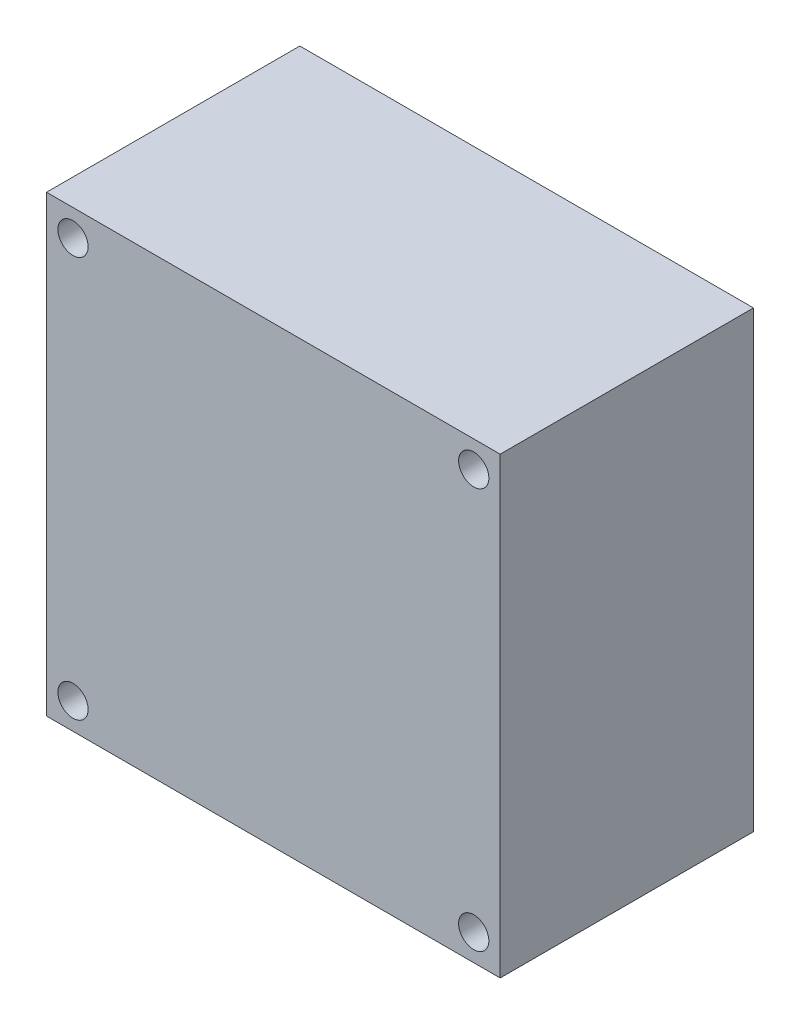
ISO-10303-21;
HEADER;
FILE_DESCRIPTION(('STEP AP214'),'2;1');
FILE_NAME('part.step','',(''),(''),'','','');
FILE_SCHEMA(('AUTOMOTIVE_DESIGN { 1 0 10303 214 1 1 1 1 }'));
ENDSEC;
DATA;
#1=APPLICATION_CONTEXT('core data for automotive mechanical design processes');
#2=APPLICATION_PROTOCOL_DEFINITION('international standard','automotive_design',2000,#1);
#3=PRODUCT_CONTEXT('',#1,'mechanical');
#4=PRODUCT('Part','Part','',(#3));
#5=PRODUCT_RELATED_PRODUCT_CATEGORY('part','',(#4));
#6=PRODUCT_DEFINITION_FORMATION('','',#4);
#7=PRODUCT_DEFINITION_CONTEXT('part definition',#1,'design');
#8=PRODUCT_DEFINITION('design','',#6,#7);
#9=PRODUCT_DEFINITION_SHAPE('','',#8);
#10=(LENGTH_UNIT() NAMED_UNIT(*) SI_UNIT(.MILLI.,.METRE.));
#11=(NAMED_UNIT(*) PLANE_ANGLE_UNIT() SI_UNIT($,.RADIAN.));
#12=(NAMED_UNIT(*) SI_UNIT($,.STERADIAN.) SOLID_ANGLE_UNIT());
#13=UNCERTAINTY_MEASURE_WITH_UNIT(LENGTH_MEASURE(1.E-05),#10,'distance_accuracy_value','');
#14=(GEOMETRIC_REPRESENTATION_CONTEXT(3) GLOBAL_UNCERTAINTY_ASSIGNED_CONTEXT((#13)) GLOBAL_UNIT_ASSIGNED_CONTEXT((#10,
#11,#12)) REPRESENTATION_CONTEXT('',''));
#15=CARTESIAN_POINT('',(0.,0.,0.));
#16=DIRECTION('',(0.,0.,1.));
#17=DIRECTION('',(1.,0.,0.));
#18=AXIS2_PLACEMENT_3D('',#15,#16,#17);
#19=CARTESIAN_POINT('',(0.,0.,67.));
#20=DIRECTION('',(1.,0.,0.));
#21=DIRECTION('',(0.,1.,0.));
#22=AXIS2_PLACEMENT_3D('',#19,#20,#21);
#23=PLANE('',#22);
#24=DIRECTION('',(0.,-1.,0.));
#25=VECTOR('',#24,1.);
#26=CARTESIAN_POINT('',(0.,0.,0.));
#27=LINE('',#26,#25);
#28=CARTESIAN_POINT('',(0.,120.,0.));
#29=VERTEX_POINT('',#28);
#30=CARTESIAN_POINT('',(0.,0.,0.));
#31=VERTEX_POINT('',#30);
#32=EDGE_CURVE('E111',#29,#31,#27,.T.);
#33=ORIENTED_EDGE('',*,*,#32,.T.);
#34=DIRECTION('',(0.,0.,-1.));
#35=VECTOR('',#34,1.);
#36=CARTESIAN_POINT('',(0.,0.,67.));
#37=LINE('',#36,#35);
#38=CARTESIAN_POINT('',(0.,0.,67.));
#39=VERTEX_POINT('',#38);
#40=EDGE_CURVE('E11',#39,#31,#37,.T.);
#41=ORIENTED_EDGE('',*,*,#40,.F.);
#42=DIRECTION('',(0.,-1.,0.));
#43=VECTOR('',#42,1.);
#44=CARTESIAN_POINT('',(0.,0.,67.));
#45=LINE('',#44,#43);
#46=CARTESIAN_POINT('',(0.,120.,67.));
#47=VERTEX_POINT('',#46);
#48=EDGE_CURVE('E95',#47,#39,#45,.T.);
#49=ORIENTED_EDGE('',*,*,#48,.F.);
#50=DIRECTION('',(0.,0.,-1.));
#51=VECTOR('',#50,1.);
#52=CARTESIAN_POINT('',(0.,120.,67.));
#53=LINE('',#52,#51);
#54=EDGE_CURVE('E107',#47,#29,#53,.T.);
#55=ORIENTED_EDGE('',*,*,#54,.T.);
#56=EDGE_LOOP('',(#33,#41,#49,#55));
#57=FACE_BOUND('',#56,.T.);
#58=ADVANCED_FACE('F43',(#57),#23,.F.);
#59=CARTESIAN_POINT('',(0.,0.,67.));
#60=DIRECTION('',(0.,1.,0.));
#61=DIRECTION('',(0.,0.,1.));
#62=AXIS2_PLACEMENT_3D('',#59,#60,#61);
#63=PLANE('',#62);
#64=DIRECTION('',(1.,0.,0.));
#65=VECTOR('',#64,1.);
#66=CARTESIAN_POINT('',(0.,0.,0.));
#67=LINE('',#66,#65);
#68=CARTESIAN_POINT('',(120.,0.,0.));
#69=VERTEX_POINT('',#68);
#70=EDGE_CURVE('E100',#31,#69,#67,.T.);
#71=ORIENTED_EDGE('',*,*,#70,.T.);
#72=DIRECTION('',(0.,0.,-1.));
#73=VECTOR('',#72,1.);
#74=CARTESIAN_POINT('',(120.,0.,67.));
#75=LINE('',#74,#73);
#76=CARTESIAN_POINT('',(120.,0.,67.));
#77=VERTEX_POINT('',#76);
#78=EDGE_CURVE('E52',#77,#69,#75,.T.);
#79=ORIENTED_EDGE('',*,*,#78,.F.);
#80=DIRECTION('',(1.,0.,0.));
#81=VECTOR('',#80,1.);
#82=CARTESIAN_POINT('',(0.,0.,67.));
#83=LINE('',#82,#81);
#84=EDGE_CURVE('E90',#39,#77,#83,.T.);
#85=ORIENTED_EDGE('',*,*,#84,.F.);
#86=ORIENTED_EDGE('',*,*,#40,.T.);
#87=EDGE_LOOP('',(#71,#79,#85,#86));
#88=FACE_BOUND('',#87,.T.);
#89=ADVANCED_FACE('F99',(#88),#63,.F.);
#90=CARTESIAN_POINT('',(120.,0.,67.));
#91=DIRECTION('',(-1.,0.,0.));
#92=DIRECTION('',(0.,-1.,0.));
#93=AXIS2_PLACEMENT_3D('',#90,#91,#92);
#94=PLANE('',#93);
#95=DIRECTION('',(0.,1.,0.));
#96=VECTOR('',#95,1.);
#97=CARTESIAN_POINT('',(120.,0.,0.));
#98=LINE('',#97,#96);
#99=CARTESIAN_POINT('',(120.,120.,0.));
#100=VERTEX_POINT('',#99);
#101=EDGE_CURVE('E77',#69,#100,#98,.T.);
#102=ORIENTED_EDGE('',*,*,#101,.T.);
#103=DIRECTION('',(0.,0.,-1.));
#104=VECTOR('',#103,1.);
#105=CARTESIAN_POINT('',(120.,120.,67.));
#106=LINE('',#105,#104);
#107=CARTESIAN_POINT('',(120.,120.,67.));
#108=VERTEX_POINT('',#107);
#109=EDGE_CURVE('E102',#108,#100,#106,.T.);
#110=ORIENTED_EDGE('',*,*,#109,.F.);
#111=DIRECTION('',(0.,1.,0.));
#112=VECTOR('',#111,1.);
#113=CARTESIAN_POINT('',(120.,0.,67.));
#114=LINE('',#113,#112);
#115=EDGE_CURVE('E93',#77,#108,#114,.T.);
#116=ORIENTED_EDGE('',*,*,#115,.F.);
#117=ORIENTED_EDGE('',*,*,#78,.T.);
#118=EDGE_LOOP('',(#102,#110,#116,#117));
#119=FACE_BOUND('',#118,.T.);
#120=ADVANCED_FACE('F103',(#119),#94,.F.);
#121=CARTESIAN_POINT('',(0.,120.,67.));
#122=DIRECTION('',(0.,-1.,0.));
#123=DIRECTION('',(0.,0.,-1.));
#124=AXIS2_PLACEMENT_3D('',#121,#122,#123);
#125=PLANE('',#124);
#126=DIRECTION('',(-1.,0.,0.));
#127=VECTOR('',#126,1.);
#128=CARTESIAN_POINT('',(0.,120.,0.));
#129=LINE('',#128,#127);
#130=EDGE_CURVE('E83',#100,#29,#129,.T.);
#131=ORIENTED_EDGE('',*,*,#130,.T.);
#132=ORIENTED_EDGE('',*,*,#54,.F.);
#133=DIRECTION('',(-1.,0.,0.));
#134=VECTOR('',#133,1.);
#135=CARTESIAN_POINT('',(0.,120.,67.));
#136=LINE('',#135,#134);
#137=EDGE_CURVE('E60',#108,#47,#136,.T.);
#138=ORIENTED_EDGE('',*,*,#137,.F.);
#139=ORIENTED_EDGE('',*,*,#109,.T.);
#140=EDGE_LOOP('',(#131,#132,#138,#139));
#141=FACE_BOUND('',#140,.T.);
#142=ADVANCED_FACE('F125',(#141),#125,.F.);
#143=CARTESIAN_POINT('',(0.,0.,67.));
#144=DIRECTION('',(0.,0.,-1.));
#145=DIRECTION('',(-1.,0.,0.));
#146=AXIS2_PLACEMENT_3D('',#143,#144,#145);
#147=PLANE('',#146);
#148=CARTESIAN_POINT('',(6.99999999999999,7.,67.));
#149=DIRECTION('',(0.,0.,1.));
#150=DIRECTION('',(1.,0.,0.));
#151=AXIS2_PLACEMENT_3D('',#148,#149,#150);
#152=CIRCLE('',#151,4.);
#153=CARTESIAN_POINT('',(11.,7.,67.));
#154=VERTEX_POINT('',#153);
#155=EDGE_CURVE('E136',#154,#154,#152,.T.);
#156=ORIENTED_EDGE('',*,*,#155,.F.);
#157=EDGE_LOOP('',(#156));
#158=FACE_BOUND('',#157,.T.);
#159=CARTESIAN_POINT('',(113.,113.,67.));
#160=DIRECTION('',(0.,0.,1.));
#161=DIRECTION('',(-1.,0.,0.));
#162=AXIS2_PLACEMENT_3D('',#159,#160,#161);
#163=CIRCLE('',#162,4.00000000000002);
#164=CARTESIAN_POINT('',(109.,113.,67.));
#165=VERTEX_POINT('',#164);
#166=EDGE_CURVE('E144',#165,#165,#163,.T.);
#167=ORIENTED_EDGE('',*,*,#166,.F.);
#168=EDGE_LOOP('',(#167));
#169=FACE_BOUND('',#168,.T.);
#170=CARTESIAN_POINT('',(113.,7.,67.));
#171=DIRECTION('',(0.,0.,1.));
#172=DIRECTION('',(-1.,0.,0.));
#173=AXIS2_PLACEMENT_3D('',#170,#171,#172);
#174=CIRCLE('',#173,4.00000000000002);
#175=CARTESIAN_POINT('',(109.,7.,67.));
#176=VERTEX_POINT('',#175);
#177=EDGE_CURVE('E145',#176,#176,#174,.T.);
#178=ORIENTED_EDGE('',*,*,#177,.F.);
#179=EDGE_LOOP('',(#178));
#180=FACE_BOUND('',#179,.T.);
#181=CARTESIAN_POINT('',(6.99999999999999,113.,67.));
#182=DIRECTION('',(0.,0.,1.));
#183=DIRECTION('',(1.,0.,0.));
#184=AXIS2_PLACEMENT_3D('',#181,#182,#183);
#185=CIRCLE('',#184,4.);
#186=CARTESIAN_POINT('',(11.,113.,67.));
#187=VERTEX_POINT('',#186);
#188=EDGE_CURVE('E132',#187,#187,#185,.T.);
#189=ORIENTED_EDGE('',*,*,#188,.F.);
#190=EDGE_LOOP('',(#189));
#191=FACE_BOUND('',#190,.T.);
#192=ORIENTED_EDGE('',*,*,#48,.T.);
#193=ORIENTED_EDGE('',*,*,#84,.T.);
#194=ORIENTED_EDGE('',*,*,#115,.T.);
#195=ORIENTED_EDGE('',*,*,#137,.T.);
#196=EDGE_LOOP('',(#192,#193,#194,#195));
#197=FACE_BOUND('',#196,.T.);
#198=ADVANCED_FACE('F91',(#158,#169,#180,#191,#197),#147,.F.);
#199=CARTESIAN_POINT('',(0.,0.,0.));
#200=DIRECTION('',(0.,0.,-1.));
#201=DIRECTION('',(-1.,0.,0.));
#202=AXIS2_PLACEMENT_3D('',#199,#200,#201);
#203=PLANE('',#202);
#204=ORIENTED_EDGE('',*,*,#32,.F.);
#205=ORIENTED_EDGE('',*,*,#130,.F.);
#206=ORIENTED_EDGE('',*,*,#101,.F.);
#207=ORIENTED_EDGE('',*,*,#70,.F.);
#208=EDGE_LOOP('',(#204,#205,#206,#207));
#209=FACE_BOUND('',#208,.T.);
#210=ADVANCED_FACE('F128',(#209),#203,.T.);
#211=CARTESIAN_POINT('',(6.99999999999999,113.,42.));
#212=DIRECTION('',(0.,0.,1.));
#213=DIRECTION('',(1.,0.,0.));
#214=AXIS2_PLACEMENT_3D('',#211,#212,#213);
#215=CYLINDRICAL_SURFACE('',#214,4.);
#216=CARTESIAN_POINT('',(6.99999999999999,113.,42.));
#217=DIRECTION('',(0.,0.,1.));
#218=DIRECTION('',(1.,0.,0.));
#219=AXIS2_PLACEMENT_3D('',#216,#217,#218);
#220=CIRCLE('',#219,4.);
#221=CARTESIAN_POINT('',(11.,113.,42.));
#222=VERTEX_POINT('',#221);
#223=EDGE_CURVE('E115',#222,#222,#220,.T.);
#224=ORIENTED_EDGE('',*,*,#223,.F.);
#225=EDGE_LOOP('',(#224));
#226=FACE_BOUND('',#225,.T.);
#227=ORIENTED_EDGE('',*,*,#188,.T.);
#228=EDGE_LOOP('',(#227));
#229=FACE_BOUND('',#228,.T.);
#230=ADVANCED_FACE('F172',(#226,#229),#215,.F.);
#231=CARTESIAN_POINT('',(6.99999999999999,113.,42.));
#232=DIRECTION('',(0.,0.,1.));
#233=DIRECTION('',(1.,0.,0.));
#234=AXIS2_PLACEMENT_3D('',#231,#232,#233);
#235=PLANE('',#234);
#236=ORIENTED_EDGE('',*,*,#223,.T.);
#237=EDGE_LOOP('',(#236));
#238=FACE_BOUND('',#237,.T.);
#239=ADVANCED_FACE('F174',(#238),#235,.T.);
#240=CARTESIAN_POINT('',(113.,7.,42.));
#241=DIRECTION('',(0.,0.,1.));
#242=DIRECTION('',(1.,0.,0.));
#243=AXIS2_PLACEMENT_3D('',#240,#241,#242);
#244=CYLINDRICAL_SURFACE('',#243,4.00000000000002);
#245=CARTESIAN_POINT('',(113.,7.,42.));
#246=DIRECTION('',(0.,0.,1.));
#247=DIRECTION('',(-1.,0.,0.));
#248=AXIS2_PLACEMENT_3D('',#245,#246,#247);
#249=CIRCLE('',#248,4.00000000000002);
#250=CARTESIAN_POINT('',(109.,7.,42.));
#251=VERTEX_POINT('',#250);
#252=EDGE_CURVE('E156',#251,#251,#249,.T.);
#253=ORIENTED_EDGE('',*,*,#252,.F.);
#254=EDGE_LOOP('',(#253));
#255=FACE_BOUND('',#254,.T.);
#256=ORIENTED_EDGE('',*,*,#177,.T.);
#257=EDGE_LOOP('',(#256));
#258=FACE_BOUND('',#257,.T.);
#259=ADVANCED_FACE('F164',(#255,#258),#244,.F.);
#260=CARTESIAN_POINT('',(113.,7.,42.));
#261=DIRECTION('',(0.,0.,-1.));
#262=DIRECTION('',(-1.,0.,0.));
#263=AXIS2_PLACEMENT_3D('',#260,#261,#262);
#264=PLANE('',#263);
#265=ORIENTED_EDGE('',*,*,#252,.T.);
#266=EDGE_LOOP('',(#265));
#267=FACE_BOUND('',#266,.T.);
#268=ADVANCED_FACE('F236',(#267),#264,.F.);
#269=CARTESIAN_POINT('',(113.,113.,42.));
#270=DIRECTION('',(0.,0.,1.));
#271=DIRECTION('',(1.,0.,0.));
#272=AXIS2_PLACEMENT_3D('',#269,#270,#271);
#273=CYLINDRICAL_SURFACE('',#272,4.00000000000002);
#274=CARTESIAN_POINT('',(113.,113.,42.));
#275=DIRECTION('',(0.,0.,1.));
#276=DIRECTION('',(-1.,0.,0.));
#277=AXIS2_PLACEMENT_3D('',#274,#275,#276);
#278=CIRCLE('',#277,4.00000000000002);
#279=CARTESIAN_POINT('',(109.,113.,42.));
#280=VERTEX_POINT('',#279);
#281=EDGE_CURVE('E140',#280,#280,#278,.T.);
#282=ORIENTED_EDGE('',*,*,#281,.F.);
#283=EDGE_LOOP('',(#282));
#284=FACE_BOUND('',#283,.T.);
#285=ORIENTED_EDGE('',*,*,#166,.T.);
#286=EDGE_LOOP('',(#285));
#287=FACE_BOUND('',#286,.T.);
#288=ADVANCED_FACE('F247',(#284,#287),#273,.F.);
#289=CARTESIAN_POINT('',(113.,113.,42.));
#290=DIRECTION('',(0.,0.,-1.));
#291=DIRECTION('',(-1.,0.,0.));
#292=AXIS2_PLACEMENT_3D('',#289,#290,#291);
#293=PLANE('',#292);
#294=ORIENTED_EDGE('',*,*,#281,.T.);
#295=EDGE_LOOP('',(#294));
#296=FACE_BOUND('',#295,.T.);
#297=ADVANCED_FACE('F258',(#296),#293,.F.);
#298=CARTESIAN_POINT('',(6.99999999999999,7.,42.));
#299=DIRECTION('',(0.,0.,1.));
#300=DIRECTION('',(1.,0.,0.));
#301=AXIS2_PLACEMENT_3D('',#298,#299,#300);
#302=CYLINDRICAL_SURFACE('',#301,4.);
#303=CARTESIAN_POINT('',(6.99999999999999,7.,42.));
#304=DIRECTION('',(0.,0.,1.));
#305=DIRECTION('',(1.,0.,0.));
#306=AXIS2_PLACEMENT_3D('',#303,#304,#305);
#307=CIRCLE('',#306,4.);
#308=CARTESIAN_POINT('',(11.,7.,42.));
#309=VERTEX_POINT('',#308);
#310=EDGE_CURVE('E149',#309,#309,#307,.T.);
#311=ORIENTED_EDGE('',*,*,#310,.F.);
#312=EDGE_LOOP('',(#311));
#313=FACE_BOUND('',#312,.T.);
#314=ORIENTED_EDGE('',*,*,#155,.T.);
#315=EDGE_LOOP('',(#314));
#316=FACE_BOUND('',#315,.T.);
#317=ADVANCED_FACE('F269',(#313,#316),#302,.F.);
#318=CARTESIAN_POINT('',(6.99999999999999,7.,42.));
#319=DIRECTION('',(0.,0.,1.));
#320=DIRECTION('',(1.,0.,0.));
#321=AXIS2_PLACEMENT_3D('',#318,#319,#320);
#322=PLANE('',#321);
#323=ORIENTED_EDGE('',*,*,#310,.T.);
#324=EDGE_LOOP('',(#323));
#325=FACE_BOUND('',#324,.T.);
#326=ADVANCED_FACE('F280',(#325),#322,.T.);
#327=CLOSED_SHELL('',(#58,#89,#120,#142,#198,#210,#230,#239,#259,#268,#288,#297,#317,#326));
#328=MANIFOLD_SOLID_BREP('B2',#327);
#329=ADVANCED_BREP_SHAPE_REPRESENTATION('',(#18,#328),#14);
#330=SHAPE_DEFINITION_REPRESENTATION(#9,#329);
ENDSEC;
END-ISO-10303-21;
